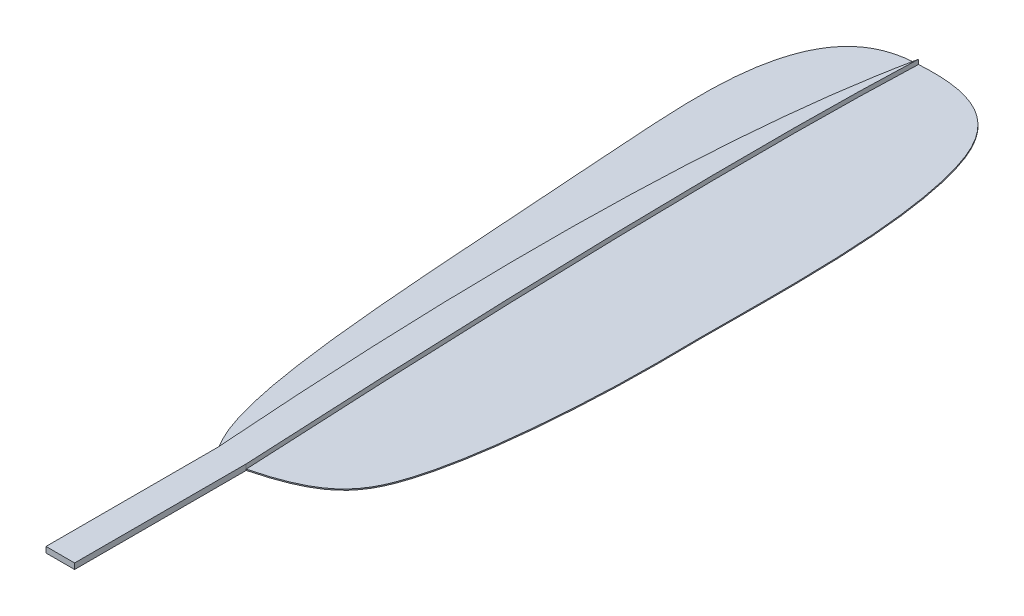
ISO-10303-21;
HEADER;
FILE_DESCRIPTION(('STEP AP214'),'2;1');
FILE_NAME('part.step','',(''),(''),'','','');
FILE_SCHEMA(('AUTOMOTIVE_DESIGN { 1 0 10303 214 1 1 1 1 }'));
ENDSEC;
DATA;
#1=APPLICATION_CONTEXT('core data for automotive mechanical design processes');
#2=APPLICATION_PROTOCOL_DEFINITION('international standard','automotive_design',2000,#1);
#3=PRODUCT_CONTEXT('',#1,'mechanical');
#4=PRODUCT('Part','Part','',(#3));
#5=PRODUCT_RELATED_PRODUCT_CATEGORY('part','',(#4));
#6=PRODUCT_DEFINITION_FORMATION('','',#4);
#7=PRODUCT_DEFINITION_CONTEXT('part definition',#1,'design');
#8=PRODUCT_DEFINITION('design','',#6,#7);
#9=PRODUCT_DEFINITION_SHAPE('','',#8);
#10=(LENGTH_UNIT() NAMED_UNIT(*) SI_UNIT(.MILLI.,.METRE.));
#11=(NAMED_UNIT(*) PLANE_ANGLE_UNIT() SI_UNIT($,.RADIAN.));
#12=(NAMED_UNIT(*) SI_UNIT($,.STERADIAN.) SOLID_ANGLE_UNIT());
#13=UNCERTAINTY_MEASURE_WITH_UNIT(LENGTH_MEASURE(1.E-05),#10,'distance_accuracy_value','');
#14=(GEOMETRIC_REPRESENTATION_CONTEXT(3) GLOBAL_UNCERTAINTY_ASSIGNED_CONTEXT((#13)) GLOBAL_UNIT_ASSIGNED_CONTEXT((#10,
#11,#12)) REPRESENTATION_CONTEXT('',''));
#15=CARTESIAN_POINT('',(0.,0.,0.));
#16=DIRECTION('',(0.,0.,1.));
#17=DIRECTION('',(1.,0.,0.));
#18=AXIS2_PLACEMENT_3D('',#15,#16,#17);
#19=CARTESIAN_POINT('',(-2.5,1.,0.));
#20=CARTESIAN_POINT('',(-8.33151031217227,1.,-79.885222780422));
#21=CARTESIAN_POINT('',(0.,1.,-120.));
#22=B_SPLINE_CURVE_WITH_KNOTS('',2,(#19,#20,#21),.UNSPECIFIED.,.F.,.F.,(3,3),(0.,1.),.UNSPECIFIED.);
#23=DIRECTION('',(0.,-1.,0.));
#24=VECTOR('',#23,1.);
#25=SURFACE_OF_LINEAR_EXTRUSION('',#22,#24);
#26=CARTESIAN_POINT('',(-2.5,0.2,0.));
#27=CARTESIAN_POINT('',(-8.33151031217227,0.2,-79.885222780422));
#28=CARTESIAN_POINT('',(0.,0.2,-120.));
#29=B_SPLINE_CURVE_WITH_KNOTS('',2,(#26,#27,#28),.UNSPECIFIED.,.F.,.F.,(3,3),(0.,1.),.UNSPECIFIED.);
#30=CARTESIAN_POINT('',(-2.5,0.2,0.));
#31=VERTEX_POINT('',#30);
#32=CARTESIAN_POINT('',(0.,0.2,-120.));
#33=VERTEX_POINT('',#32);
#34=EDGE_CURVE('E97',#31,#33,#29,.T.);
#35=ORIENTED_EDGE('',*,*,#34,.F.);
#36=DIRECTION('',(0.,-1.,0.));
#37=VECTOR('',#36,1.);
#38=CARTESIAN_POINT('',(-2.5,1.,0.));
#39=LINE('',#38,#37);
#40=CARTESIAN_POINT('',(-2.5,1.,0.));
#41=VERTEX_POINT('',#40);
#42=EDGE_CURVE('E12',#41,#31,#39,.T.);
#43=ORIENTED_EDGE('',*,*,#42,.F.);
#44=CARTESIAN_POINT('',(0.,1.,-120.));
#45=VERTEX_POINT('',#44);
#46=EDGE_CURVE('E263',#41,#45,#22,.T.);
#47=ORIENTED_EDGE('',*,*,#46,.T.);
#48=DIRECTION('',(0.,-1.,0.));
#49=VECTOR('',#48,1.);
#50=CARTESIAN_POINT('',(0.,1.,-120.));
#51=LINE('',#50,#49);
#52=EDGE_CURVE('E187',#45,#33,#51,.T.);
#53=ORIENTED_EDGE('',*,*,#52,.T.);
#54=EDGE_LOOP('',(#35,#43,#47,#53));
#55=FACE_BOUND('',#54,.T.);
#56=ADVANCED_FACE('F79',(#55),#25,.T.);
#57=CARTESIAN_POINT('',(-2.5,1.,0.));
#58=DIRECTION('',(1.,0.,0.));
#59=DIRECTION('',(0.,0.,-1.));
#60=AXIS2_PLACEMENT_3D('',#57,#58,#59);
#61=PLANE('',#60);
#62=DIRECTION('',(0.,0.,1.));
#63=VECTOR('',#62,1.);
#64=CARTESIAN_POINT('',(-2.5,0.,0.));
#65=LINE('',#64,#63);
#66=CARTESIAN_POINT('',(-2.5,0.,0.));
#67=VERTEX_POINT('',#66);
#68=CARTESIAN_POINT('',(-2.5,0.,30.));
#69=VERTEX_POINT('',#68);
#70=EDGE_CURVE('E156',#67,#69,#65,.T.);
#71=ORIENTED_EDGE('',*,*,#70,.T.);
#72=DIRECTION('',(0.,-1.,0.));
#73=VECTOR('',#72,1.);
#74=CARTESIAN_POINT('',(-2.5,1.,30.));
#75=LINE('',#74,#73);
#76=CARTESIAN_POINT('',(-2.5,1.,30.));
#77=VERTEX_POINT('',#76);
#78=EDGE_CURVE('E89',#77,#69,#75,.T.);
#79=ORIENTED_EDGE('',*,*,#78,.F.);
#80=DIRECTION('',(0.,0.,1.));
#81=VECTOR('',#80,1.);
#82=CARTESIAN_POINT('',(-2.5,1.,0.));
#83=LINE('',#82,#81);
#84=EDGE_CURVE('E266',#41,#77,#83,.T.);
#85=ORIENTED_EDGE('',*,*,#84,.F.);
#86=ORIENTED_EDGE('',*,*,#42,.T.);
#87=DIRECTION('',(0.,-1.,0.));
#88=VECTOR('',#87,1.);
#89=CARTESIAN_POINT('',(-2.5,0.2,0.));
#90=LINE('',#89,#88);
#91=EDGE_CURVE('E160',#31,#67,#90,.T.);
#92=ORIENTED_EDGE('',*,*,#91,.T.);
#93=EDGE_LOOP('',(#71,#79,#85,#86,#92));
#94=FACE_BOUND('',#93,.T.);
#95=ADVANCED_FACE('F281',(#94),#61,.F.);
#96=CARTESIAN_POINT('',(0.,1.,30.));
#97=DIRECTION('',(0.,0.,-1.));
#98=DIRECTION('',(-1.,0.,0.));
#99=AXIS2_PLACEMENT_3D('',#96,#97,#98);
#100=PLANE('',#99);
#101=DIRECTION('',(1.,0.,0.));
#102=VECTOR('',#101,1.);
#103=CARTESIAN_POINT('',(0.,0.,30.));
#104=LINE('',#103,#102);
#105=CARTESIAN_POINT('',(2.5,0.,30.));
#106=VERTEX_POINT('',#105);
#107=EDGE_CURVE('E259',#69,#106,#104,.T.);
#108=ORIENTED_EDGE('',*,*,#107,.T.);
#109=DIRECTION('',(0.,-1.,0.));
#110=VECTOR('',#109,1.);
#111=CARTESIAN_POINT('',(2.5,1.,30.));
#112=LINE('',#111,#110);
#113=CARTESIAN_POINT('',(2.5,1.,30.));
#114=VERTEX_POINT('',#113);
#115=EDGE_CURVE('E199',#114,#106,#112,.T.);
#116=ORIENTED_EDGE('',*,*,#115,.F.);
#117=DIRECTION('',(1.,0.,0.));
#118=VECTOR('',#117,1.);
#119=CARTESIAN_POINT('',(0.,1.,30.));
#120=LINE('',#119,#118);
#121=EDGE_CURVE('E269',#77,#114,#120,.T.);
#122=ORIENTED_EDGE('',*,*,#121,.F.);
#123=ORIENTED_EDGE('',*,*,#78,.T.);
#124=EDGE_LOOP('',(#108,#116,#122,#123));
#125=FACE_BOUND('',#124,.T.);
#126=ADVANCED_FACE('F285',(#125),#100,.F.);
#127=CARTESIAN_POINT('',(2.5,1.,0.));
#128=DIRECTION('',(1.,0.,0.));
#129=DIRECTION('',(0.,0.,-1.));
#130=AXIS2_PLACEMENT_3D('',#127,#128,#129);
#131=PLANE('',#130);
#132=DIRECTION('',(0.,0.,1.));
#133=VECTOR('',#132,1.);
#134=CARTESIAN_POINT('',(2.5,0.,0.));
#135=LINE('',#134,#133);
#136=CARTESIAN_POINT('',(2.5,0.,0.));
#137=VERTEX_POINT('',#136);
#138=EDGE_CURVE('E196',#137,#106,#135,.T.);
#139=ORIENTED_EDGE('',*,*,#138,.F.);
#140=DIRECTION('',(0.,-1.,0.));
#141=VECTOR('',#140,1.);
#142=CARTESIAN_POINT('',(2.5,0.2,0.));
#143=LINE('',#142,#141);
#144=CARTESIAN_POINT('',(2.5,0.2,0.));
#145=VERTEX_POINT('',#144);
#146=EDGE_CURVE('E104',#145,#137,#143,.T.);
#147=ORIENTED_EDGE('',*,*,#146,.F.);
#148=DIRECTION('',(0.,-1.,0.));
#149=VECTOR('',#148,1.);
#150=CARTESIAN_POINT('',(2.5,1.,0.));
#151=LINE('',#150,#149);
#152=CARTESIAN_POINT('',(2.5,1.,0.));
#153=VERTEX_POINT('',#152);
#154=EDGE_CURVE('E191',#153,#145,#151,.T.);
#155=ORIENTED_EDGE('',*,*,#154,.F.);
#156=DIRECTION('',(0.,0.,1.));
#157=VECTOR('',#156,1.);
#158=CARTESIAN_POINT('',(2.5,1.,0.));
#159=LINE('',#158,#157);
#160=EDGE_CURVE('E253',#153,#114,#159,.T.);
#161=ORIENTED_EDGE('',*,*,#160,.T.);
#162=ORIENTED_EDGE('',*,*,#115,.T.);
#163=EDGE_LOOP('',(#139,#147,#155,#161,#162));
#164=FACE_BOUND('',#163,.T.);
#165=ADVANCED_FACE('F245',(#164),#131,.T.);
#166=CARTESIAN_POINT('',(2.5,1.,0.));
#167=CARTESIAN_POINT('',(-1.63918434809833,1.,-79.8301801534041));
#168=CARTESIAN_POINT('',(0.,1.,-120.));
#169=B_SPLINE_CURVE_WITH_KNOTS('',2,(#166,#167,#168),.UNSPECIFIED.,.F.,.F.,(3,3),(0.,1.),.UNSPECIFIED.);
#170=DIRECTION('',(0.,-1.,0.));
#171=VECTOR('',#170,1.);
#172=SURFACE_OF_LINEAR_EXTRUSION('',#169,#171);
#173=ORIENTED_EDGE('',*,*,#154,.T.);
#174=CARTESIAN_POINT('',(2.5,0.2,0.));
#175=CARTESIAN_POINT('',(-1.63918434809833,0.2,-79.8301801534041));
#176=CARTESIAN_POINT('',(0.,0.2,-120.));
#177=B_SPLINE_CURVE_WITH_KNOTS('',2,(#174,#175,#176),.UNSPECIFIED.,.F.,.F.,(3,3),(0.,1.),.UNSPECIFIED.);
#178=EDGE_CURVE('E148',#145,#33,#177,.T.);
#179=ORIENTED_EDGE('',*,*,#178,.T.);
#180=ORIENTED_EDGE('',*,*,#52,.F.);
#181=EDGE_CURVE('E192',#153,#45,#169,.T.);
#182=ORIENTED_EDGE('',*,*,#181,.F.);
#183=EDGE_LOOP('',(#173,#179,#180,#182));
#184=FACE_BOUND('',#183,.T.);
#185=ADVANCED_FACE('F209',(#184),#172,.F.);
#186=CARTESIAN_POINT('',(0.,1.,0.));
#187=DIRECTION('',(0.,1.,0.));
#188=DIRECTION('',(0.,0.,1.));
#189=AXIS2_PLACEMENT_3D('',#186,#187,#188);
#190=PLANE('',#189);
#191=ORIENTED_EDGE('',*,*,#46,.F.);
#192=ORIENTED_EDGE('',*,*,#84,.T.);
#193=ORIENTED_EDGE('',*,*,#121,.T.);
#194=ORIENTED_EDGE('',*,*,#160,.F.);
#195=ORIENTED_EDGE('',*,*,#181,.T.);
#196=EDGE_LOOP('',(#191,#192,#193,#194,#195));
#197=FACE_BOUND('',#196,.T.);
#198=ADVANCED_FACE('F236',(#197),#190,.T.);
#199=CARTESIAN_POINT('',(0.,0.,0.));
#200=DIRECTION('',(0.,1.,0.));
#201=DIRECTION('',(0.,0.,1.));
#202=AXIS2_PLACEMENT_3D('',#199,#200,#201);
#203=PLANE('',#202);
#204=ORIENTED_EDGE('',*,*,#70,.F.);
#205=CARTESIAN_POINT('',(0.,0.,-120.));
#206=CARTESIAN_POINT('',(-7.35753604473764,0.,-119.756200735484));
#207=CARTESIAN_POINT('',(-16.1290850450273,0.,-114.539529428317));
#208=CARTESIAN_POINT('',(-10.9603733752496,0.,-43.6234008673658));
#209=CARTESIAN_POINT('',(-9.55772822347636,0.,-8.383257229566));
#210=CARTESIAN_POINT('',(-2.49999999999996,0.,0.));
#211=B_SPLINE_CURVE_WITH_KNOTS('',3,(#205,#206,#207,#208,#209,#210),.UNSPECIFIED.,.F.,.F.,(4,1,
1,4),(0.,0.313531983306057,0.413531983306057,1.),.UNSPECIFIED.);
#212=CARTESIAN_POINT('',(0.,0.,-120.));
#213=VERTEX_POINT('',#212);
#214=EDGE_CURVE('E153',#213,#67,#211,.T.);
#215=ORIENTED_EDGE('',*,*,#214,.F.);
#216=CARTESIAN_POINT('',(2.5,0.,0.));
#217=CARTESIAN_POINT('',(12.9321772701419,0.,-2.69277735338155));
#218=CARTESIAN_POINT('',(20.6279943308919,0.,-11.5396284607813));
#219=CARTESIAN_POINT('',(22.5371310758555,0.,-45.0797012935605));
#220=CARTESIAN_POINT('',(22.0311742333022,0.,-66.3710382076405));
#221=CARTESIAN_POINT('',(23.1433872131367,0.,-92.940026455697));
#222=CARTESIAN_POINT('',(16.0822538299438,0.,-117.629559659014));
#223=CARTESIAN_POINT('',(8.94241288910098,0.,-120.567138422392));
#224=CARTESIAN_POINT('',(0.,0.,-120.));
#225=B_SPLINE_CURVE_WITH_KNOTS('',3,(#216,#217,#218,#219,#220,#221,#222,#223,#224),
.UNSPECIFIED.,.F.,.F.,(4,1,1,1,1,1,4),(0.,0.156099619785498,0.394681350415879,0.460940872053778,
0.75243531452659,0.809984907852122,1.),.UNSPECIFIED.);
#226=EDGE_CURVE('E138',#137,#213,#225,.T.);
#227=ORIENTED_EDGE('',*,*,#226,.F.);
#228=ORIENTED_EDGE('',*,*,#138,.T.);
#229=ORIENTED_EDGE('',*,*,#107,.F.);
#230=EDGE_LOOP('',(#204,#215,#227,#228,#229));
#231=FACE_BOUND('',#230,.T.);
#232=ADVANCED_FACE('F154',(#231),#203,.F.);
#233=CARTESIAN_POINT('',(2.5,0.2,0.));
#234=CARTESIAN_POINT('',(12.9321772701419,0.2,-2.69277735338155));
#235=CARTESIAN_POINT('',(20.6279943308919,0.2,-11.5396284607813));
#236=CARTESIAN_POINT('',(22.5371310758555,0.2,-45.0797012935605));
#237=CARTESIAN_POINT('',(22.0311742333022,0.2,-66.3710382076405));
#238=CARTESIAN_POINT('',(23.1433872131367,0.2,-92.940026455697));
#239=CARTESIAN_POINT('',(16.0822538299438,0.2,-117.629559659014));
#240=CARTESIAN_POINT('',(8.94241288910098,0.2,-120.567138422392));
#241=CARTESIAN_POINT('',(0.,0.2,-120.));
#242=B_SPLINE_CURVE_WITH_KNOTS('',3,(#233,#234,#235,#236,#237,#238,#239,#240,#241),
.UNSPECIFIED.,.F.,.F.,(4,1,1,1,1,1,4),(0.,0.156099619785498,0.394681350415879,0.460940872053778,
0.75243531452659,0.809984907852122,1.),.UNSPECIFIED.);
#243=DIRECTION('',(0.,-1.,0.));
#244=VECTOR('',#243,1.);
#245=SURFACE_OF_LINEAR_EXTRUSION('',#242,#244);
#246=ORIENTED_EDGE('',*,*,#226,.T.);
#247=DIRECTION('',(0.,-1.,0.));
#248=VECTOR('',#247,1.);
#249=CARTESIAN_POINT('',(0.,0.2,-120.));
#250=LINE('',#249,#248);
#251=EDGE_CURVE('E143',#33,#213,#250,.T.);
#252=ORIENTED_EDGE('',*,*,#251,.F.);
#253=EDGE_CURVE('E165',#145,#33,#242,.T.);
#254=ORIENTED_EDGE('',*,*,#253,.F.);
#255=ORIENTED_EDGE('',*,*,#146,.T.);
#256=EDGE_LOOP('',(#246,#252,#254,#255));
#257=FACE_BOUND('',#256,.T.);
#258=ADVANCED_FACE('F140',(#257),#245,.F.);
#259=CARTESIAN_POINT('',(0.,0.2,0.));
#260=DIRECTION('',(0.,1.,0.));
#261=DIRECTION('',(0.,0.,1.));
#262=AXIS2_PLACEMENT_3D('',#259,#260,#261);
#263=PLANE('',#262);
#264=ORIENTED_EDGE('',*,*,#178,.F.);
#265=ORIENTED_EDGE('',*,*,#253,.T.);
#266=EDGE_LOOP('',(#264,#265));
#267=FACE_BOUND('',#266,.T.);
#268=ADVANCED_FACE('F214',(#267),#263,.T.);
#269=CARTESIAN_POINT('',(0.,0.2,-120.));
#270=CARTESIAN_POINT('',(-7.35753604473764,0.2,-119.756200735484));
#271=CARTESIAN_POINT('',(-16.1290850450273,0.2,-114.539529428317));
#272=CARTESIAN_POINT('',(-10.9603733752496,0.2,-43.6234008673658));
#273=CARTESIAN_POINT('',(-9.55772822347636,0.2,-8.383257229566));
#274=CARTESIAN_POINT('',(-2.49999999999996,0.2,0.));
#275=B_SPLINE_CURVE_WITH_KNOTS('',3,(#269,#270,#271,#272,#273,#274),.UNSPECIFIED.,.F.,.F.,(4,1,
1,4),(0.,0.313531983306057,0.413531983306057,1.),.UNSPECIFIED.);
#276=DIRECTION('',(0.,-1.,0.));
#277=VECTOR('',#276,1.);
#278=SURFACE_OF_LINEAR_EXTRUSION('',#275,#277);
#279=ORIENTED_EDGE('',*,*,#214,.T.);
#280=ORIENTED_EDGE('',*,*,#91,.F.);
#281=EDGE_CURVE('E149',#33,#31,#275,.T.);
#282=ORIENTED_EDGE('',*,*,#281,.F.);
#283=ORIENTED_EDGE('',*,*,#251,.T.);
#284=EDGE_LOOP('',(#279,#280,#282,#283));
#285=FACE_BOUND('',#284,.T.);
#286=ADVANCED_FACE('F162',(#285),#278,.F.);
#287=CARTESIAN_POINT('',(0.,0.2,0.));
#288=DIRECTION('',(0.,1.,0.));
#289=DIRECTION('',(0.,0.,1.));
#290=AXIS2_PLACEMENT_3D('',#287,#288,#289);
#291=PLANE('',#290);
#292=ORIENTED_EDGE('',*,*,#34,.T.);
#293=ORIENTED_EDGE('',*,*,#281,.T.);
#294=EDGE_LOOP('',(#292,#293));
#295=FACE_BOUND('',#294,.T.);
#296=ADVANCED_FACE('F304',(#295),#291,.T.);
#297=CLOSED_SHELL('',(#56,#95,#126,#165,#185,#198,#232,#258,#268,#286,#296));
#298=MANIFOLD_SOLID_BREP('B2',#297);
#299=ADVANCED_BREP_SHAPE_REPRESENTATION('',(#18,#298),#14);
#300=SHAPE_DEFINITION_REPRESENTATION(#9,#299);
ENDSEC;
END-ISO-10303-21;
